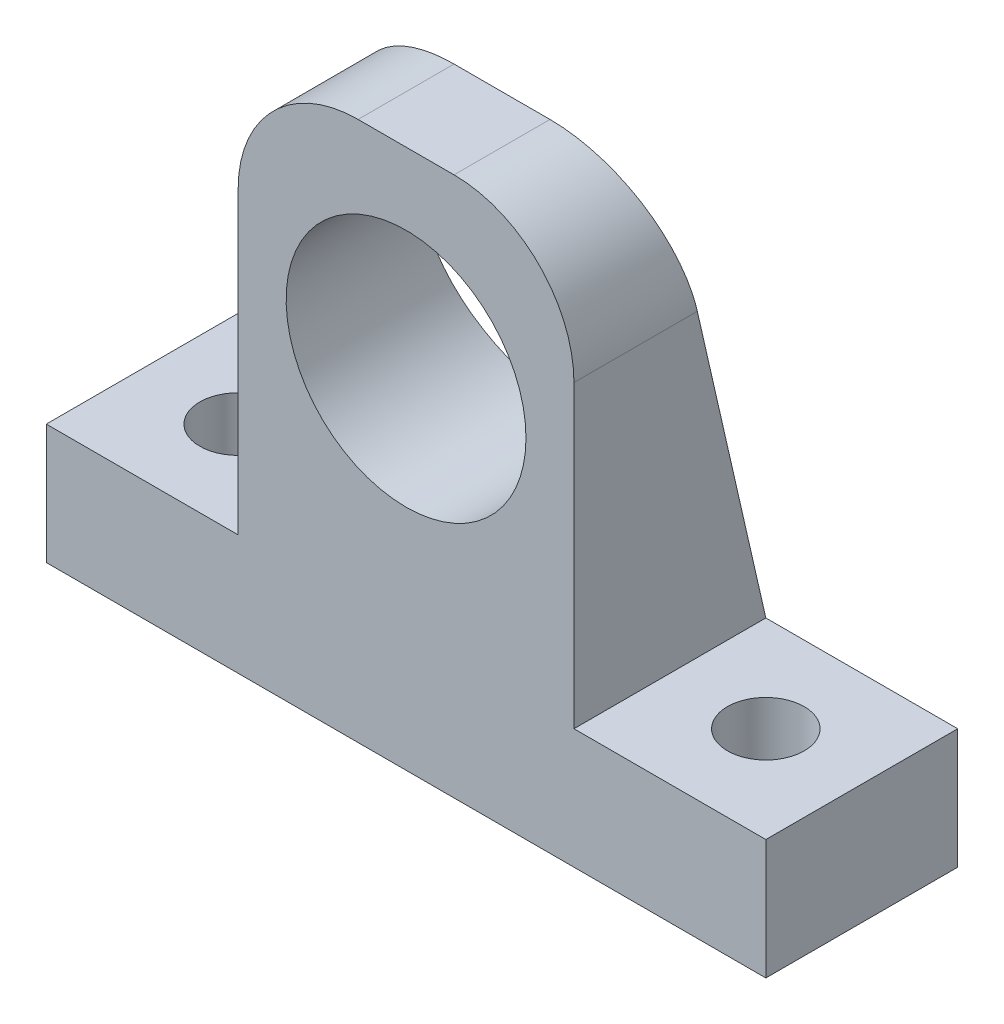
ISO-10303-21;
HEADER;
FILE_DESCRIPTION(('STEP AP214'),'2;1');
FILE_NAME('part.step','',(''),(''),'','','');
FILE_SCHEMA(('AUTOMOTIVE_DESIGN { 1 0 10303 214 1 1 1 1 }'));
ENDSEC;
DATA;
#1=APPLICATION_CONTEXT('core data for automotive mechanical design processes');
#2=APPLICATION_PROTOCOL_DEFINITION('international standard','automotive_design',2000,#1);
#3=PRODUCT_CONTEXT('',#1,'mechanical');
#4=PRODUCT('Part','Part','',(#3));
#5=PRODUCT_RELATED_PRODUCT_CATEGORY('part','',(#4));
#6=PRODUCT_DEFINITION_FORMATION('','',#4);
#7=PRODUCT_DEFINITION_CONTEXT('part definition',#1,'design');
#8=PRODUCT_DEFINITION('design','',#6,#7);
#9=PRODUCT_DEFINITION_SHAPE('','',#8);
#10=(LENGTH_UNIT() NAMED_UNIT(*) SI_UNIT(.MILLI.,.METRE.));
#11=(NAMED_UNIT(*) PLANE_ANGLE_UNIT() SI_UNIT($,.RADIAN.));
#12=(NAMED_UNIT(*) SI_UNIT($,.STERADIAN.) SOLID_ANGLE_UNIT());
#13=UNCERTAINTY_MEASURE_WITH_UNIT(LENGTH_MEASURE(1.E-05),#10,'distance_accuracy_value','');
#14=(GEOMETRIC_REPRESENTATION_CONTEXT(3) GLOBAL_UNCERTAINTY_ASSIGNED_CONTEXT((#13)) GLOBAL_UNIT_ASSIGNED_CONTEXT((#10,
#11,#12)) REPRESENTATION_CONTEXT('',''));
#15=CARTESIAN_POINT('',(0.,0.,0.));
#16=DIRECTION('',(0.,0.,1.));
#17=DIRECTION('',(1.,0.,0.));
#18=AXIS2_PLACEMENT_3D('',#15,#16,#17);
#19=CARTESIAN_POINT('',(2.,17.5,0.));
#20=DIRECTION('',(0.,0.,1.));
#21=DIRECTION('',(1.,0.,0.));
#22=AXIS2_PLACEMENT_3D('',#19,#20,#21);
#23=PLANE('',#22);
#24=DIRECTION('',(1.,0.,0.));
#25=VECTOR('',#24,1.);
#26=CARTESIAN_POINT('',(-100.429798925095,5.,0.));
#27=LINE('',#26,#25);
#28=CARTESIAN_POINT('',(-7.,5.,0.));
#29=VERTEX_POINT('',#28);
#30=CARTESIAN_POINT('',(7.,5.,0.));
#31=VERTEX_POINT('',#30);
#32=EDGE_CURVE('E138',#29,#31,#27,.T.);
#33=ORIENTED_EDGE('',*,*,#32,.T.);
#34=DIRECTION('',(-1.,0.,0.));
#35=VECTOR('',#34,1.);
#36=CARTESIAN_POINT('',(15.,5.,0.));
#37=LINE('',#36,#35);
#38=CARTESIAN_POINT('',(15.,5.,0.));
#39=VERTEX_POINT('',#38);
#40=EDGE_CURVE('E183',#39,#31,#37,.T.);
#41=ORIENTED_EDGE('',*,*,#40,.F.);
#42=DIRECTION('',(0.,1.,0.));
#43=VECTOR('',#42,1.);
#44=CARTESIAN_POINT('',(15.,0.,0.));
#45=LINE('',#44,#43);
#46=CARTESIAN_POINT('',(15.,0.,0.));
#47=VERTEX_POINT('',#46);
#48=EDGE_CURVE('E158',#47,#39,#45,.T.);
#49=ORIENTED_EDGE('',*,*,#48,.F.);
#50=DIRECTION('',(1.,0.,0.));
#51=VECTOR('',#50,1.);
#52=CARTESIAN_POINT('',(0.,0.,0.));
#53=LINE('',#52,#51);
#54=CARTESIAN_POINT('',(-15.,0.,0.));
#55=VERTEX_POINT('',#54);
#56=EDGE_CURVE('E163',#55,#47,#53,.T.);
#57=ORIENTED_EDGE('',*,*,#56,.F.);
#58=DIRECTION('',(0.,-1.,0.));
#59=VECTOR('',#58,1.);
#60=CARTESIAN_POINT('',(-15.,0.,0.));
#61=LINE('',#60,#59);
#62=CARTESIAN_POINT('',(-15.,5.,0.));
#63=VERTEX_POINT('',#62);
#64=EDGE_CURVE('E188',#63,#55,#61,.T.);
#65=ORIENTED_EDGE('',*,*,#64,.F.);
#66=DIRECTION('',(-1.,0.,0.));
#67=VECTOR('',#66,1.);
#68=CARTESIAN_POINT('',(-15.,5.,0.));
#69=LINE('',#68,#67);
#70=EDGE_CURVE('E186',#29,#63,#69,.T.);
#71=ORIENTED_EDGE('',*,*,#70,.F.);
#72=EDGE_LOOP('',(#33,#41,#49,#57,#65,#71));
#73=FACE_BOUND('',#72,.T.);
#74=ADVANCED_FACE('F33',(#73),#23,.F.);
#75=CARTESIAN_POINT('',(7.,5.,8.));
#76=DIRECTION('',(-1.,0.,0.));
#77=DIRECTION('',(0.,0.,1.));
#78=AXIS2_PLACEMENT_3D('',#75,#76,#77);
#79=PLANE('',#78);
#80=DIRECTION('',(0.,-0.974858506571867,-0.222824801502141));
#81=VECTOR('',#80,1.);
#82=CARTESIAN_POINT('',(7.,6.7377812257564,0.397207137315748));
#83=LINE('',#82,#81);
#84=CARTESIAN_POINT('',(7.,17.5,2.85714285714285));
#85=VERTEX_POINT('',#84);
#86=EDGE_CURVE('E50',#85,#31,#83,.T.);
#87=ORIENTED_EDGE('',*,*,#86,.F.);
#88=DIRECTION('',(0.,0.,-1.));
#89=VECTOR('',#88,1.);
#90=CARTESIAN_POINT('',(7.,17.5,8.));
#91=LINE('',#90,#89);
#92=CARTESIAN_POINT('',(7.,17.5,8.));
#93=VERTEX_POINT('',#92);
#94=EDGE_CURVE('E200',#93,#85,#91,.T.);
#95=ORIENTED_EDGE('',*,*,#94,.F.);
#96=DIRECTION('',(0.,1.,0.));
#97=VECTOR('',#96,1.);
#98=CARTESIAN_POINT('',(7.,5.,8.));
#99=LINE('',#98,#97);
#100=CARTESIAN_POINT('',(7.,5.,8.));
#101=VERTEX_POINT('',#100);
#102=EDGE_CURVE('E167',#101,#93,#99,.T.);
#103=ORIENTED_EDGE('',*,*,#102,.F.);
#104=DIRECTION('',(0.,0.,-1.));
#105=VECTOR('',#104,1.);
#106=CARTESIAN_POINT('',(7.,5.,8.));
#107=LINE('',#106,#105);
#108=EDGE_CURVE('E202',#101,#31,#107,.T.);
#109=ORIENTED_EDGE('',*,*,#108,.T.);
#110=EDGE_LOOP('',(#87,#95,#103,#109));
#111=FACE_BOUND('',#110,.T.);
#112=ADVANCED_FACE('F228',(#111),#79,.F.);
#113=CARTESIAN_POINT('',(2.,17.5,8.));
#114=DIRECTION('',(0.,0.,-1.));
#115=DIRECTION('',(-1.,0.,0.));
#116=AXIS2_PLACEMENT_3D('',#113,#114,#115);
#117=CYLINDRICAL_SURFACE('',#116,5.);
#118=CARTESIAN_POINT('',(2.,17.5,2.85714285714286));
#119=DIRECTION('',(0.,0.222824801502141,-0.974858506571867));
#120=DIRECTION('',(0.,-0.974858506571867,-0.222824801502141));
#121=AXIS2_PLACEMENT_3D('',#118,#119,#120);
#122=ELLIPSE('',#121,5.12894944886178,5.);
#123=CARTESIAN_POINT('',(1.99999999999996,22.5,4.));
#124=VERTEX_POINT('',#123);
#125=EDGE_CURVE('E57',#124,#85,#122,.T.);
#126=ORIENTED_EDGE('',*,*,#125,.F.);
#127=DIRECTION('',(0.,0.,-1.));
#128=VECTOR('',#127,1.);
#129=CARTESIAN_POINT('',(1.99999999999996,22.5,8.));
#130=LINE('',#129,#128);
#131=CARTESIAN_POINT('',(1.99999999999996,22.5,8.));
#132=VERTEX_POINT('',#131);
#133=EDGE_CURVE('E198',#132,#124,#130,.T.);
#134=ORIENTED_EDGE('',*,*,#133,.F.);
#135=CARTESIAN_POINT('',(2.,17.5,8.));
#136=DIRECTION('',(0.,0.,1.));
#137=DIRECTION('',(1.,0.,0.));
#138=AXIS2_PLACEMENT_3D('',#135,#136,#137);
#139=CIRCLE('',#138,5.);
#140=EDGE_CURVE('E169',#93,#132,#139,.T.);
#141=ORIENTED_EDGE('',*,*,#140,.F.);
#142=ORIENTED_EDGE('',*,*,#94,.T.);
#143=EDGE_LOOP('',(#126,#134,#141,#142));
#144=FACE_BOUND('',#143,.T.);
#145=ADVANCED_FACE('F234',(#144),#117,.T.);
#146=CARTESIAN_POINT('',(-1.99999999999996,22.5,8.));
#147=DIRECTION('',(0.,-1.,0.));
#148=DIRECTION('',(0.,0.,-1.));
#149=AXIS2_PLACEMENT_3D('',#146,#147,#148);
#150=PLANE('',#149);
#151=DIRECTION('',(1.,0.,0.));
#152=VECTOR('',#151,1.);
#153=CARTESIAN_POINT('',(-100.429798925095,22.5,4.));
#154=LINE('',#153,#152);
#155=CARTESIAN_POINT('',(-1.99999999999996,22.5,4.));
#156=VERTEX_POINT('',#155);
#157=EDGE_CURVE('E141',#156,#124,#154,.T.);
#158=ORIENTED_EDGE('',*,*,#157,.F.);
#159=DIRECTION('',(0.,0.,-1.));
#160=VECTOR('',#159,1.);
#161=CARTESIAN_POINT('',(-1.99999999999996,22.5,8.));
#162=LINE('',#161,#160);
#163=CARTESIAN_POINT('',(-1.99999999999996,22.5,8.));
#164=VERTEX_POINT('',#163);
#165=EDGE_CURVE('E125',#164,#156,#162,.T.);
#166=ORIENTED_EDGE('',*,*,#165,.F.);
#167=DIRECTION('',(-1.,0.,0.));
#168=VECTOR('',#167,1.);
#169=CARTESIAN_POINT('',(-1.99999999999996,22.5,8.));
#170=LINE('',#169,#168);
#171=EDGE_CURVE('E171',#132,#164,#170,.T.);
#172=ORIENTED_EDGE('',*,*,#171,.F.);
#173=ORIENTED_EDGE('',*,*,#133,.T.);
#174=EDGE_LOOP('',(#158,#166,#172,#173));
#175=FACE_BOUND('',#174,.T.);
#176=ADVANCED_FACE('F256',(#175),#150,.F.);
#177=CARTESIAN_POINT('',(-2.,17.5,8.));
#178=DIRECTION('',(0.,0.,-1.));
#179=DIRECTION('',(-1.,0.,0.));
#180=AXIS2_PLACEMENT_3D('',#177,#178,#179);
#181=CYLINDRICAL_SURFACE('',#180,5.);
#182=CARTESIAN_POINT('',(-2.,17.5,2.85714285714286));
#183=DIRECTION('',(0.,0.222824801502141,-0.974858506571867));
#184=DIRECTION('',(0.,-0.974858506571867,-0.222824801502141));
#185=AXIS2_PLACEMENT_3D('',#182,#183,#184);
#186=ELLIPSE('',#185,5.12894944886178,5.);
#187=CARTESIAN_POINT('',(-7.,17.5,2.85714285714285));
#188=VERTEX_POINT('',#187);
#189=EDGE_CURVE('E130',#188,#156,#186,.T.);
#190=ORIENTED_EDGE('',*,*,#189,.F.);
#191=DIRECTION('',(0.,0.,-1.));
#192=VECTOR('',#191,1.);
#193=CARTESIAN_POINT('',(-7.,17.5,8.));
#194=LINE('',#193,#192);
#195=CARTESIAN_POINT('',(-7.,17.5,8.));
#196=VERTEX_POINT('',#195);
#197=EDGE_CURVE('E115',#196,#188,#194,.T.);
#198=ORIENTED_EDGE('',*,*,#197,.F.);
#199=CARTESIAN_POINT('',(-2.,17.5,8.));
#200=DIRECTION('',(0.,0.,1.));
#201=DIRECTION('',(-1.,0.,0.));
#202=AXIS2_PLACEMENT_3D('',#199,#200,#201);
#203=CIRCLE('',#202,5.);
#204=EDGE_CURVE('E173',#164,#196,#203,.T.);
#205=ORIENTED_EDGE('',*,*,#204,.F.);
#206=ORIENTED_EDGE('',*,*,#165,.T.);
#207=EDGE_LOOP('',(#190,#198,#205,#206));
#208=FACE_BOUND('',#207,.T.);
#209=ADVANCED_FACE('F131',(#208),#181,.T.);
#210=CARTESIAN_POINT('',(-7.,5.,8.));
#211=DIRECTION('',(1.,0.,0.));
#212=DIRECTION('',(0.,0.,-1.));
#213=AXIS2_PLACEMENT_3D('',#210,#211,#212);
#214=PLANE('',#213);
#215=DIRECTION('',(0.,0.974858506571867,0.222824801502141));
#216=VECTOR('',#215,1.);
#217=CARTESIAN_POINT('',(-7.,6.7377812257564,0.397207137315748));
#218=LINE('',#217,#216);
#219=EDGE_CURVE('E120',#29,#188,#218,.T.);
#220=ORIENTED_EDGE('',*,*,#219,.F.);
#221=DIRECTION('',(0.,0.,-1.));
#222=VECTOR('',#221,1.);
#223=CARTESIAN_POINT('',(-7.,5.,8.));
#224=LINE('',#223,#222);
#225=CARTESIAN_POINT('',(-7.,5.,8.));
#226=VERTEX_POINT('',#225);
#227=EDGE_CURVE('E126',#226,#29,#224,.T.);
#228=ORIENTED_EDGE('',*,*,#227,.F.);
#229=DIRECTION('',(0.,-1.,0.));
#230=VECTOR('',#229,1.);
#231=CARTESIAN_POINT('',(-7.,5.,8.));
#232=LINE('',#231,#230);
#233=EDGE_CURVE('E122',#196,#226,#232,.T.);
#234=ORIENTED_EDGE('',*,*,#233,.F.);
#235=ORIENTED_EDGE('',*,*,#197,.T.);
#236=EDGE_LOOP('',(#220,#228,#234,#235));
#237=FACE_BOUND('',#236,.T.);
#238=ADVANCED_FACE('F117',(#237),#214,.F.);
#239=CARTESIAN_POINT('',(0.,14.5,8.));
#240=DIRECTION('',(0.,0.,-1.));
#241=DIRECTION('',(-1.,0.,0.));
#242=AXIS2_PLACEMENT_3D('',#239,#240,#241);
#243=CYLINDRICAL_SURFACE('',#242,5.);
#244=CARTESIAN_POINT('',(0.,14.5,8.));
#245=DIRECTION('',(0.,0.,1.));
#246=DIRECTION('',(1.,0.,0.));
#247=AXIS2_PLACEMENT_3D('',#244,#245,#246);
#248=CIRCLE('',#247,5.);
#249=CARTESIAN_POINT('',(5.,14.5,8.));
#250=VERTEX_POINT('',#249);
#251=EDGE_CURVE('E155',#250,#250,#248,.T.);
#252=ORIENTED_EDGE('',*,*,#251,.T.);
#253=EDGE_LOOP('',(#252));
#254=FACE_BOUND('',#253,.T.);
#255=CARTESIAN_POINT('',(0.,14.5,2.17142857142857));
#256=DIRECTION('',(0.,0.222824801502141,-0.974858506571867));
#257=DIRECTION('',(0.,-0.974858506571867,-0.222824801502141));
#258=AXIS2_PLACEMENT_3D('',#255,#256,#257);
#259=ELLIPSE('',#258,5.12894944886178,5.);
#260=CARTESIAN_POINT('',(0.,9.5,1.02857142857143));
#261=VERTEX_POINT('',#260);
#262=EDGE_CURVE('E37',#261,#261,#259,.T.);
#263=ORIENTED_EDGE('',*,*,#262,.T.);
#264=EDGE_LOOP('',(#263));
#265=FACE_BOUND('',#264,.T.);
#266=ADVANCED_FACE('F253',(#254,#265),#243,.F.);
#267=CARTESIAN_POINT('',(2.,17.5,8.));
#268=DIRECTION('',(0.,0.,1.));
#269=DIRECTION('',(1.,0.,0.));
#270=AXIS2_PLACEMENT_3D('',#267,#268,#269);
#271=PLANE('',#270);
#272=DIRECTION('',(1.,0.,0.));
#273=VECTOR('',#272,1.);
#274=CARTESIAN_POINT('',(0.,0.,8.));
#275=LINE('',#274,#273);
#276=CARTESIAN_POINT('',(-15.,0.,8.));
#277=VERTEX_POINT('',#276);
#278=CARTESIAN_POINT('',(15.,0.,8.));
#279=VERTEX_POINT('',#278);
#280=EDGE_CURVE('E159',#277,#279,#275,.T.);
#281=ORIENTED_EDGE('',*,*,#280,.T.);
#282=DIRECTION('',(0.,1.,0.));
#283=VECTOR('',#282,1.);
#284=CARTESIAN_POINT('',(15.,0.,8.));
#285=LINE('',#284,#283);
#286=CARTESIAN_POINT('',(15.,5.,8.));
#287=VERTEX_POINT('',#286);
#288=EDGE_CURVE('E162',#279,#287,#285,.T.);
#289=ORIENTED_EDGE('',*,*,#288,.T.);
#290=DIRECTION('',(-1.,0.,0.));
#291=VECTOR('',#290,1.);
#292=CARTESIAN_POINT('',(15.,5.,8.));
#293=LINE('',#292,#291);
#294=EDGE_CURVE('E165',#287,#101,#293,.T.);
#295=ORIENTED_EDGE('',*,*,#294,.T.);
#296=ORIENTED_EDGE('',*,*,#102,.T.);
#297=ORIENTED_EDGE('',*,*,#140,.T.);
#298=ORIENTED_EDGE('',*,*,#171,.T.);
#299=ORIENTED_EDGE('',*,*,#204,.T.);
#300=ORIENTED_EDGE('',*,*,#233,.T.);
#301=DIRECTION('',(-1.,0.,0.));
#302=VECTOR('',#301,1.);
#303=CARTESIAN_POINT('',(-15.,5.,8.));
#304=LINE('',#303,#302);
#305=CARTESIAN_POINT('',(-15.,5.,8.));
#306=VERTEX_POINT('',#305);
#307=EDGE_CURVE('E176',#226,#306,#304,.T.);
#308=ORIENTED_EDGE('',*,*,#307,.T.);
#309=DIRECTION('',(0.,-1.,0.));
#310=VECTOR('',#309,1.);
#311=CARTESIAN_POINT('',(-15.,0.,8.));
#312=LINE('',#311,#310);
#313=EDGE_CURVE('E178',#306,#277,#312,.T.);
#314=ORIENTED_EDGE('',*,*,#313,.T.);
#315=EDGE_LOOP('',(#281,#289,#295,#296,#297,#298,#299,#300,#308,#314));
#316=FACE_BOUND('',#315,.T.);
#317=ORIENTED_EDGE('',*,*,#251,.F.);
#318=EDGE_LOOP('',(#317));
#319=FACE_BOUND('',#318,.T.);
#320=ADVANCED_FACE('F238',(#316,#319),#271,.T.);
#321=CARTESIAN_POINT('',(15.,0.,8.));
#322=DIRECTION('',(-1.,0.,0.));
#323=DIRECTION('',(0.,0.,1.));
#324=AXIS2_PLACEMENT_3D('',#321,#322,#323);
#325=PLANE('',#324);
#326=ORIENTED_EDGE('',*,*,#48,.T.);
#327=DIRECTION('',(0.,0.,-1.));
#328=VECTOR('',#327,1.);
#329=CARTESIAN_POINT('',(15.,5.,8.));
#330=LINE('',#329,#328);
#331=EDGE_CURVE('E42',#287,#39,#330,.T.);
#332=ORIENTED_EDGE('',*,*,#331,.F.);
#333=ORIENTED_EDGE('',*,*,#288,.F.);
#334=DIRECTION('',(0.,0.,-1.));
#335=VECTOR('',#334,1.);
#336=CARTESIAN_POINT('',(15.,0.,8.));
#337=LINE('',#336,#335);
#338=EDGE_CURVE('E11',#279,#47,#337,.T.);
#339=ORIENTED_EDGE('',*,*,#338,.T.);
#340=EDGE_LOOP('',(#326,#332,#333,#339));
#341=FACE_BOUND('',#340,.T.);
#342=ADVANCED_FACE('F35',(#341),#325,.F.);
#343=CARTESIAN_POINT('',(15.,5.,8.));
#344=DIRECTION('',(0.,-1.,0.));
#345=DIRECTION('',(1.,0.,0.));
#346=AXIS2_PLACEMENT_3D('',#343,#344,#345);
#347=PLANE('',#346);
#348=CARTESIAN_POINT('',(11.,5.,4.));
#349=DIRECTION('',(0.,1.,0.));
#350=DIRECTION('',(0.,0.,-1.));
#351=AXIS2_PLACEMENT_3D('',#348,#349,#350);
#352=CIRCLE('',#351,1.6);
#353=CARTESIAN_POINT('',(11.,5.,2.4));
#354=VERTEX_POINT('',#353);
#355=EDGE_CURVE('E147',#354,#354,#352,.T.);
#356=ORIENTED_EDGE('',*,*,#355,.F.);
#357=EDGE_LOOP('',(#356));
#358=FACE_BOUND('',#357,.T.);
#359=ORIENTED_EDGE('',*,*,#40,.T.);
#360=ORIENTED_EDGE('',*,*,#108,.F.);
#361=ORIENTED_EDGE('',*,*,#294,.F.);
#362=ORIENTED_EDGE('',*,*,#331,.T.);
#363=EDGE_LOOP('',(#359,#360,#361,#362));
#364=FACE_BOUND('',#363,.T.);
#365=ADVANCED_FACE('F249',(#358,#364),#347,.F.);
#366=CARTESIAN_POINT('',(-15.,5.,8.));
#367=DIRECTION('',(0.,-1.,0.));
#368=DIRECTION('',(0.,0.,-1.));
#369=AXIS2_PLACEMENT_3D('',#366,#367,#368);
#370=PLANE('',#369);
#371=CARTESIAN_POINT('',(-11.,5.,4.));
#372=DIRECTION('',(0.,1.,0.));
#373=DIRECTION('',(0.,0.,1.));
#374=AXIS2_PLACEMENT_3D('',#371,#372,#373);
#375=CIRCLE('',#374,1.6);
#376=CARTESIAN_POINT('',(-11.,5.,5.6));
#377=VERTEX_POINT('',#376);
#378=EDGE_CURVE('E151',#377,#377,#375,.T.);
#379=ORIENTED_EDGE('',*,*,#378,.F.);
#380=EDGE_LOOP('',(#379));
#381=FACE_BOUND('',#380,.T.);
#382=ORIENTED_EDGE('',*,*,#70,.T.);
#383=DIRECTION('',(0.,0.,-1.));
#384=VECTOR('',#383,1.);
#385=CARTESIAN_POINT('',(-15.,5.,8.));
#386=LINE('',#385,#384);
#387=EDGE_CURVE('E193',#306,#63,#386,.T.);
#388=ORIENTED_EDGE('',*,*,#387,.F.);
#389=ORIENTED_EDGE('',*,*,#307,.F.);
#390=ORIENTED_EDGE('',*,*,#227,.T.);
#391=EDGE_LOOP('',(#382,#388,#389,#390));
#392=FACE_BOUND('',#391,.T.);
#393=ADVANCED_FACE('F245',(#381,#392),#370,.F.);
#394=CARTESIAN_POINT('',(-15.,0.,8.));
#395=DIRECTION('',(1.,0.,0.));
#396=DIRECTION('',(0.,0.,-1.));
#397=AXIS2_PLACEMENT_3D('',#394,#395,#396);
#398=PLANE('',#397);
#399=ORIENTED_EDGE('',*,*,#64,.T.);
#400=DIRECTION('',(0.,0.,-1.));
#401=VECTOR('',#400,1.);
#402=CARTESIAN_POINT('',(-15.,0.,8.));
#403=LINE('',#402,#401);
#404=EDGE_CURVE('E181',#277,#55,#403,.T.);
#405=ORIENTED_EDGE('',*,*,#404,.F.);
#406=ORIENTED_EDGE('',*,*,#313,.F.);
#407=ORIENTED_EDGE('',*,*,#387,.T.);
#408=EDGE_LOOP('',(#399,#405,#406,#407));
#409=FACE_BOUND('',#408,.T.);
#410=ADVANCED_FACE('F242',(#409),#398,.F.);
#411=CARTESIAN_POINT('',(0.,0.,8.));
#412=DIRECTION('',(0.,1.,0.));
#413=DIRECTION('',(-1.,0.,0.));
#414=AXIS2_PLACEMENT_3D('',#411,#412,#413);
#415=PLANE('',#414);
#416=CARTESIAN_POINT('',(11.,0.,4.));
#417=DIRECTION('',(0.,1.,0.));
#418=DIRECTION('',(-1.,0.,0.));
#419=AXIS2_PLACEMENT_3D('',#416,#417,#418);
#420=CIRCLE('',#419,1.6);
#421=CARTESIAN_POINT('',(9.4,0.,4.));
#422=VERTEX_POINT('',#421);
#423=EDGE_CURVE('E150',#422,#422,#420,.T.);
#424=ORIENTED_EDGE('',*,*,#423,.T.);
#425=EDGE_LOOP('',(#424));
#426=FACE_BOUND('',#425,.T.);
#427=CARTESIAN_POINT('',(-11.,0.,4.));
#428=DIRECTION('',(0.,1.,0.));
#429=DIRECTION('',(-1.,0.,0.));
#430=AXIS2_PLACEMENT_3D('',#427,#428,#429);
#431=CIRCLE('',#430,1.6);
#432=CARTESIAN_POINT('',(-12.6,0.,4.));
#433=VERTEX_POINT('',#432);
#434=EDGE_CURVE('E154',#433,#433,#431,.T.);
#435=ORIENTED_EDGE('',*,*,#434,.T.);
#436=EDGE_LOOP('',(#435));
#437=FACE_BOUND('',#436,.T.);
#438=ORIENTED_EDGE('',*,*,#56,.T.);
#439=ORIENTED_EDGE('',*,*,#338,.F.);
#440=ORIENTED_EDGE('',*,*,#280,.F.);
#441=ORIENTED_EDGE('',*,*,#404,.T.);
#442=EDGE_LOOP('',(#438,#439,#440,#441));
#443=FACE_BOUND('',#442,.T.);
#444=ADVANCED_FACE('F210',(#426,#437,#443),#415,.F.);
#445=CARTESIAN_POINT('',(-11.,-5.,4.));
#446=DIRECTION('',(0.,1.,0.));
#447=DIRECTION('',(0.,0.,1.));
#448=AXIS2_PLACEMENT_3D('',#445,#446,#447);
#449=CYLINDRICAL_SURFACE('',#448,1.6);
#450=ORIENTED_EDGE('',*,*,#378,.T.);
#451=EDGE_LOOP('',(#450));
#452=FACE_BOUND('',#451,.T.);
#453=ORIENTED_EDGE('',*,*,#434,.F.);
#454=EDGE_LOOP('',(#453));
#455=FACE_BOUND('',#454,.T.);
#456=ADVANCED_FACE('F215',(#452,#455),#449,.F.);
#457=CARTESIAN_POINT('',(11.,-5.,4.));
#458=DIRECTION('',(0.,1.,0.));
#459=DIRECTION('',(0.,0.,1.));
#460=AXIS2_PLACEMENT_3D('',#457,#458,#459);
#461=CYLINDRICAL_SURFACE('',#460,1.6);
#462=ORIENTED_EDGE('',*,*,#355,.T.);
#463=EDGE_LOOP('',(#462));
#464=FACE_BOUND('',#463,.T.);
#465=ORIENTED_EDGE('',*,*,#423,.F.);
#466=EDGE_LOOP('',(#465));
#467=FACE_BOUND('',#466,.T.);
#468=ADVANCED_FACE('F213',(#464,#467),#461,.F.);
#469=CARTESIAN_POINT('',(-100.429798925095,5.,0.));
#470=DIRECTION('',(0.,0.222824801502141,-0.974858506571867));
#471=DIRECTION('',(0.,0.974858506571867,0.222824801502141));
#472=AXIS2_PLACEMENT_3D('',#469,#470,#471);
#473=PLANE('',#472);
#474=ORIENTED_EDGE('',*,*,#262,.F.);
#475=EDGE_LOOP('',(#474));
#476=FACE_BOUND('',#475,.T.);
#477=ORIENTED_EDGE('',*,*,#125,.T.);
#478=ORIENTED_EDGE('',*,*,#86,.T.);
#479=ORIENTED_EDGE('',*,*,#32,.F.);
#480=ORIENTED_EDGE('',*,*,#219,.T.);
#481=ORIENTED_EDGE('',*,*,#189,.T.);
#482=ORIENTED_EDGE('',*,*,#157,.T.);
#483=EDGE_LOOP('',(#477,#478,#479,#480,#481,#482));
#484=FACE_BOUND('',#483,.T.);
#485=ADVANCED_FACE('F137',(#476,#484),#473,.T.);
#486=CLOSED_SHELL('',(#74,#112,#145,#176,#209,#238,#266,#320,#342,#365,#393,#410,#444,#456,#468,#485));
#487=MANIFOLD_SOLID_BREP('B2',#486);
#488=ADVANCED_BREP_SHAPE_REPRESENTATION('',(#18,#487),#14);
#489=SHAPE_DEFINITION_REPRESENTATION(#9,#488);
ENDSEC;
END-ISO-10303-21;
